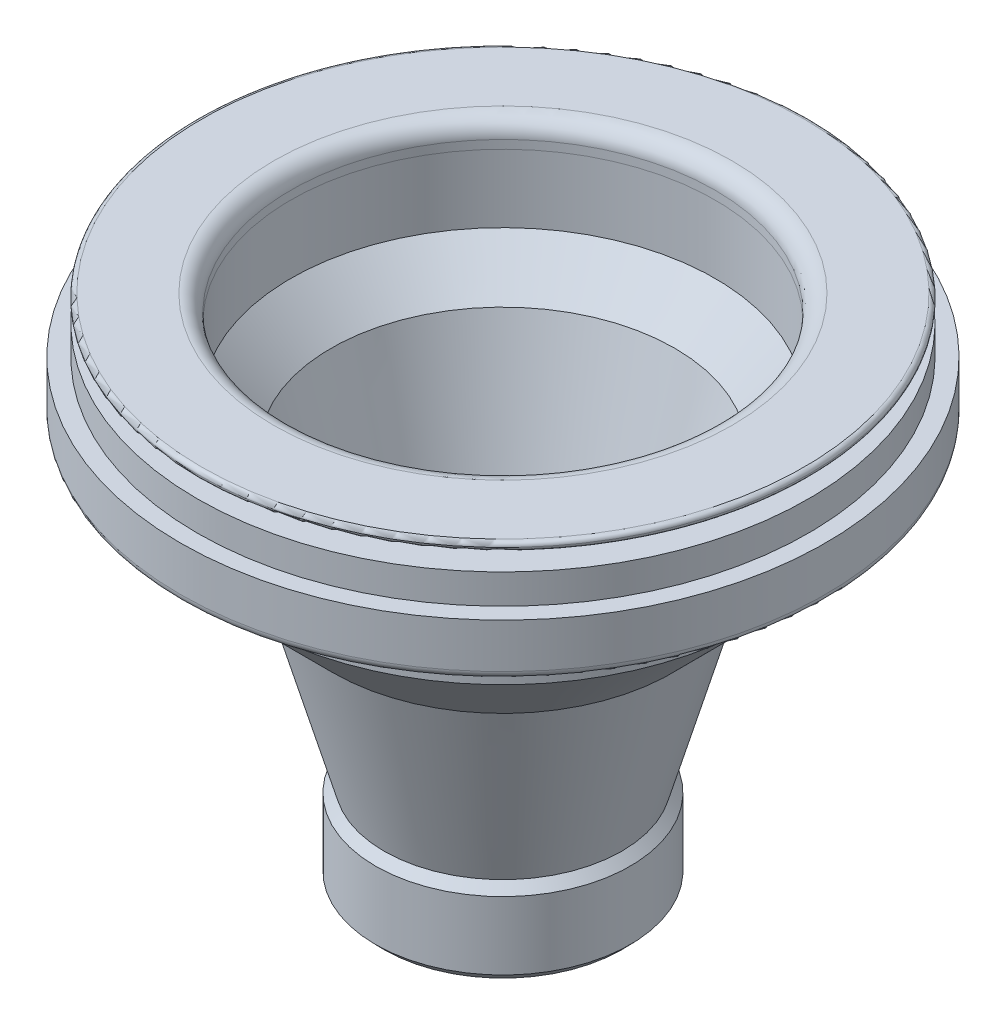
ISO-10303-21;
HEADER;
FILE_DESCRIPTION(('STEP AP214'),'2;1');
FILE_NAME('part.step','',(''),(''),'','','');
FILE_SCHEMA(('AUTOMOTIVE_DESIGN { 1 0 10303 214 1 1 1 1 }'));
ENDSEC;
DATA;
#1=APPLICATION_CONTEXT('core data for automotive mechanical design processes');
#2=APPLICATION_PROTOCOL_DEFINITION('international standard','automotive_design',2000,#1);
#3=PRODUCT_CONTEXT('',#1,'mechanical');
#4=PRODUCT('Part','Part','',(#3));
#5=PRODUCT_RELATED_PRODUCT_CATEGORY('part','',(#4));
#6=PRODUCT_DEFINITION_FORMATION('','',#4);
#7=PRODUCT_DEFINITION_CONTEXT('part definition',#1,'design');
#8=PRODUCT_DEFINITION('design','',#6,#7);
#9=PRODUCT_DEFINITION_SHAPE('','',#8);
#10=(LENGTH_UNIT() NAMED_UNIT(*) SI_UNIT(.MILLI.,.METRE.));
#11=(NAMED_UNIT(*) PLANE_ANGLE_UNIT() SI_UNIT($,.RADIAN.));
#12=(NAMED_UNIT(*) SI_UNIT($,.STERADIAN.) SOLID_ANGLE_UNIT());
#13=UNCERTAINTY_MEASURE_WITH_UNIT(LENGTH_MEASURE(1.E-05),#10,'distance_accuracy_value','');
#14=(GEOMETRIC_REPRESENTATION_CONTEXT(3) GLOBAL_UNCERTAINTY_ASSIGNED_CONTEXT((#13)) GLOBAL_UNIT_ASSIGNED_CONTEXT((#10,
#11,#12)) REPRESENTATION_CONTEXT('',''));
#15=CARTESIAN_POINT('',(0.,0.,0.));
#16=DIRECTION('',(0.,0.,1.));
#17=DIRECTION('',(1.,0.,0.));
#18=AXIS2_PLACEMENT_3D('',#15,#16,#17);
#19=CARTESIAN_POINT('',(685.8,-228.6,-317.5));
#20=DIRECTION('',(0.,1.,0.));
#21=DIRECTION('',(0.,0.,1.));
#22=AXIS2_PLACEMENT_3D('',#19,#20,#21);
#23=CYLINDRICAL_SURFACE('',#22,44.45);
#24=CARTESIAN_POINT('',(685.8,-231.775,-317.5));
#25=DIRECTION('',(0.,1.,0.));
#26=DIRECTION('',(0.,0.,1.));
#27=AXIS2_PLACEMENT_3D('',#24,#25,#26);
#28=CIRCLE('',#27,44.45);
#29=CARTESIAN_POINT('',(685.8,-231.775,-273.05));
#30=VERTEX_POINT('',#29);
#31=EDGE_CURVE('E70',#30,#30,#28,.T.);
#32=ORIENTED_EDGE('',*,*,#31,.T.);
#33=EDGE_LOOP('',(#32));
#34=FACE_BOUND('',#33,.T.);
#35=CARTESIAN_POINT('',(685.8,-228.6,-317.5));
#36=DIRECTION('',(0.,1.,0.));
#37=DIRECTION('',(0.,0.,1.));
#38=AXIS2_PLACEMENT_3D('',#35,#36,#37);
#39=CIRCLE('',#38,44.45);
#40=CARTESIAN_POINT('',(685.8,-228.6,-273.05));
#41=VERTEX_POINT('',#40);
#42=EDGE_CURVE('E64',#41,#41,#39,.T.);
#43=ORIENTED_EDGE('',*,*,#42,.F.);
#44=EDGE_LOOP('',(#43));
#45=FACE_BOUND('',#44,.T.);
#46=ADVANCED_FACE('F44',(#34,#45),#23,.T.);
#47=CARTESIAN_POINT('',(0.,-228.6,-317.5));
#48=DIRECTION('',(0.,1.,0.));
#49=DIRECTION('',(0.,0.,1.));
#50=AXIS2_PLACEMENT_3D('',#47,#48,#49);
#51=PLANE('',#50);
#52=CARTESIAN_POINT('',(685.8,-228.6,-317.5));
#53=DIRECTION('',(0.,1.,0.));
#54=DIRECTION('',(0.,0.,1.));
#55=AXIS2_PLACEMENT_3D('',#52,#53,#54);
#56=CIRCLE('',#55,56.35625);
#57=CARTESIAN_POINT('',(685.8,-228.6,-261.14375));
#58=VERTEX_POINT('',#57);
#59=EDGE_CURVE('E52',#58,#58,#56,.F.);
#60=ORIENTED_EDGE('',*,*,#59,.T.);
#61=EDGE_LOOP('',(#60));
#62=FACE_BOUND('',#61,.T.);
#63=ORIENTED_EDGE('',*,*,#42,.T.);
#64=EDGE_LOOP('',(#63));
#65=FACE_BOUND('',#64,.T.);
#66=ADVANCED_FACE('F91',(#62,#65),#51,.F.);
#67=CARTESIAN_POINT('',(3.60822483003177E-13,-227.0125,-317.5));
#68=DIRECTION('',(0.,-1.,0.));
#69=DIRECTION('',(0.,0.,-1.));
#70=AXIS2_PLACEMENT_3D('',#67,#68,#69);
#71=PLANE('',#70);
#72=CARTESIAN_POINT('',(685.8,-227.0125,-317.5));
#73=DIRECTION('',(0.,-1.,0.));
#74=DIRECTION('',(0.,0.,-1.));
#75=AXIS2_PLACEMENT_3D('',#72,#73,#74);
#76=CIRCLE('',#75,56.35625);
#77=CARTESIAN_POINT('',(685.8,-227.0125,-373.85625));
#78=VERTEX_POINT('',#77);
#79=EDGE_CURVE('E11',#78,#78,#76,.F.);
#80=ORIENTED_EDGE('',*,*,#79,.T.);
#81=EDGE_LOOP('',(#80));
#82=FACE_BOUND('',#81,.T.);
#83=CARTESIAN_POINT('',(685.8,-227.0125,-317.5));
#84=DIRECTION('',(0.,-1.,0.));
#85=DIRECTION('',(0.,0.,-1.));
#86=AXIS2_PLACEMENT_3D('',#83,#84,#85);
#87=CIRCLE('',#86,42.8625);
#88=CARTESIAN_POINT('',(685.8,-227.0125,-360.3625));
#89=VERTEX_POINT('',#88);
#90=EDGE_CURVE('E56',#89,#89,#87,.T.);
#91=ORIENTED_EDGE('',*,*,#90,.T.);
#92=EDGE_LOOP('',(#91));
#93=FACE_BOUND('',#92,.T.);
#94=ADVANCED_FACE('F96',(#82,#93),#71,.F.);
#95=CARTESIAN_POINT('',(685.8,-228.6,-317.5));
#96=DIRECTION('',(0.,1.,0.));
#97=DIRECTION('',(0.,0.,1.));
#98=AXIS2_PLACEMENT_3D('',#95,#96,#97);
#99=CYLINDRICAL_SURFACE('',#98,39.6875);
#100=CARTESIAN_POINT('',(685.8,-230.1875,-317.5));
#101=DIRECTION('',(0.,-1.,0.));
#102=DIRECTION('',(0.,0.,-1.));
#103=AXIS2_PLACEMENT_3D('',#100,#101,#102);
#104=CIRCLE('',#103,39.6875);
#105=CARTESIAN_POINT('',(685.8,-230.1875,-357.1875));
#106=VERTEX_POINT('',#105);
#107=EDGE_CURVE('E61',#106,#106,#104,.F.);
#108=ORIENTED_EDGE('',*,*,#107,.T.);
#109=EDGE_LOOP('',(#108));
#110=FACE_BOUND('',#109,.T.);
#111=CARTESIAN_POINT('',(685.8,-231.775,-317.5));
#112=DIRECTION('',(0.,1.,0.));
#113=DIRECTION('',(0.,0.,1.));
#114=AXIS2_PLACEMENT_3D('',#111,#112,#113);
#115=CIRCLE('',#114,39.6875);
#116=CARTESIAN_POINT('',(685.8,-231.775,-277.8125));
#117=VERTEX_POINT('',#116);
#118=EDGE_CURVE('E67',#117,#117,#115,.T.);
#119=ORIENTED_EDGE('',*,*,#118,.F.);
#120=EDGE_LOOP('',(#119));
#121=FACE_BOUND('',#120,.T.);
#122=ADVANCED_FACE('F103',(#110,#121),#99,.F.);
#123=CARTESIAN_POINT('',(0.,-231.775,-317.5));
#124=DIRECTION('',(0.,-1.,0.));
#125=DIRECTION('',(0.,0.,-1.));
#126=AXIS2_PLACEMENT_3D('',#123,#124,#125);
#127=PLANE('',#126);
#128=ORIENTED_EDGE('',*,*,#118,.T.);
#129=EDGE_LOOP('',(#128));
#130=FACE_BOUND('',#129,.T.);
#131=ORIENTED_EDGE('',*,*,#31,.F.);
#132=EDGE_LOOP('',(#131));
#133=FACE_BOUND('',#132,.T.);
#134=ADVANCED_FACE('F87',(#130,#133),#127,.T.);
#135=CARTESIAN_POINT('',(685.8,-230.1875,-317.5));
#136=DIRECTION('',(0.,-1.,0.));
#137=DIRECTION('',(0.,0.,-1.));
#138=AXIS2_PLACEMENT_3D('',#135,#136,#137);
#139=TOROIDAL_SURFACE('',#138,42.8625,3.175);
#140=ORIENTED_EDGE('',*,*,#90,.F.);
#141=EDGE_LOOP('',(#140));
#142=FACE_BOUND('',#141,.T.);
#143=ORIENTED_EDGE('',*,*,#107,.F.);
#144=EDGE_LOOP('',(#143));
#145=FACE_BOUND('',#144,.T.);
#146=ADVANCED_FACE('F80',(#142,#145),#139,.T.);
#147=CARTESIAN_POINT('',(685.8,-227.80625,-317.5));
#148=DIRECTION('',(0.,-1.,0.));
#149=DIRECTION('',(0.,0.,-1.));
#150=AXIS2_PLACEMENT_3D('',#147,#148,#149);
#151=TOROIDAL_SURFACE('',#150,56.35625,0.79375);
#152=ORIENTED_EDGE('',*,*,#79,.F.);
#153=EDGE_LOOP('',(#152));
#154=FACE_BOUND('',#153,.T.);
#155=CARTESIAN_POINT('',(685.8,-227.80625,-317.5));
#156=DIRECTION('',(0.,-1.,0.));
#157=DIRECTION('',(0.,0.,-1.));
#158=AXIS2_PLACEMENT_3D('',#155,#156,#157);
#159=CIRCLE('',#158,57.15);
#160=CARTESIAN_POINT('',(685.8,-227.80625,-374.65));
#161=VERTEX_POINT('',#160);
#162=EDGE_CURVE('E48',#161,#161,#159,.T.);
#163=ORIENTED_EDGE('',*,*,#162,.F.);
#164=EDGE_LOOP('',(#163));
#165=FACE_BOUND('',#164,.T.);
#166=ADVANCED_FACE('F46',(#154,#165),#151,.T.);
#167=CARTESIAN_POINT('',(685.8,-227.80625,-317.5));
#168=DIRECTION('',(0.,1.,0.));
#169=DIRECTION('',(0.,0.,1.));
#170=AXIS2_PLACEMENT_3D('',#167,#168,#169);
#171=TOROIDAL_SURFACE('',#170,56.35625,0.79375);
#172=ORIENTED_EDGE('',*,*,#59,.F.);
#173=EDGE_LOOP('',(#172));
#174=FACE_BOUND('',#173,.T.);
#175=ORIENTED_EDGE('',*,*,#162,.T.);
#176=EDGE_LOOP('',(#175));
#177=FACE_BOUND('',#176,.T.);
#178=ADVANCED_FACE('F77',(#174,#177),#171,.T.);
#179=CLOSED_SHELL('',(#46,#66,#94,#122,#134,#146,#166,#178));
#180=MANIFOLD_SOLID_BREP('B2',#179);
#181=CARTESIAN_POINT('',(685.8,-306.308125,-317.5));
#182=DIRECTION('',(0.,1.,0.));
#183=DIRECTION('',(0.,0.,1.));
#184=AXIS2_PLACEMENT_3D('',#181,#182,#183);
#185=CONICAL_SURFACE('',#184,22.2250000000001,0.275805898588525);
#186=CARTESIAN_POINT('',(685.8,-272.653125,-317.5));
#187=DIRECTION('',(0.,1.,0.));
#188=DIRECTION('',(0.,0.,1.));
#189=AXIS2_PLACEMENT_3D('',#186,#187,#188);
#190=CIRCLE('',#189,31.7500000000002);
#191=CARTESIAN_POINT('',(685.8,-272.653125,-285.75));
#192=VERTEX_POINT('',#191);
#193=EDGE_CURVE('E43',#192,#192,#190,.T.);
#194=ORIENTED_EDGE('',*,*,#193,.F.);
#195=EDGE_LOOP('',(#194));
#196=FACE_BOUND('',#195,.T.);
#197=CARTESIAN_POINT('',(685.8,-306.308125,-317.5));
#198=DIRECTION('',(0.,1.,0.));
#199=DIRECTION('',(0.,0.,1.));
#200=AXIS2_PLACEMENT_3D('',#197,#198,#199);
#201=CIRCLE('',#200,22.2250000000001);
#202=CARTESIAN_POINT('',(685.8,-306.308125,-295.275));
#203=VERTEX_POINT('',#202);
#204=EDGE_CURVE('E220',#203,#203,#201,.T.);
#205=ORIENTED_EDGE('',*,*,#204,.T.);
#206=EDGE_LOOP('',(#205));
#207=FACE_BOUND('',#206,.T.);
#208=ADVANCED_FACE('F165',(#196,#207),#185,.T.);
#209=CARTESIAN_POINT('',(685.8,-256.778125,-317.5));
#210=DIRECTION('',(0.,1.,0.));
#211=DIRECTION('',(0.,0.,1.));
#212=AXIS2_PLACEMENT_3D('',#209,#210,#211);
#213=CONICAL_SURFACE('',#212,47.625,0.785398163397445);
#214=ORIENTED_EDGE('',*,*,#193,.T.);
#215=EDGE_LOOP('',(#214));
#216=FACE_BOUND('',#215,.T.);
#217=CARTESIAN_POINT('',(685.8,-256.778125,-317.5));
#218=DIRECTION('',(0.,1.,0.));
#219=DIRECTION('',(0.,0.,1.));
#220=AXIS2_PLACEMENT_3D('',#217,#218,#219);
#221=CIRCLE('',#220,47.625);
#222=CARTESIAN_POINT('',(685.8,-256.778125,-269.875));
#223=VERTEX_POINT('',#222);
#224=EDGE_CURVE('E171',#223,#223,#221,.T.);
#225=ORIENTED_EDGE('',*,*,#224,.F.);
#226=EDGE_LOOP('',(#225));
#227=FACE_BOUND('',#226,.T.);
#228=ADVANCED_FACE('F237',(#216,#227),#213,.T.);
#229=CARTESIAN_POINT('',(685.8,-228.6,-317.5));
#230=DIRECTION('',(0.,1.,0.));
#231=DIRECTION('',(0.,0.,1.));
#232=AXIS2_PLACEMENT_3D('',#229,#230,#231);
#233=CYLINDRICAL_SURFACE('',#232,47.625);
#234=ORIENTED_EDGE('',*,*,#224,.T.);
#235=EDGE_LOOP('',(#234));
#236=FACE_BOUND('',#235,.T.);
#237=CARTESIAN_POINT('',(685.8,-247.253125,-317.5));
#238=DIRECTION('',(0.,1.,0.));
#239=DIRECTION('',(0.,0.,1.));
#240=AXIS2_PLACEMENT_3D('',#237,#238,#239);
#241=CIRCLE('',#240,47.625);
#242=CARTESIAN_POINT('',(685.8,-247.253125,-269.875));
#243=VERTEX_POINT('',#242);
#244=EDGE_CURVE('E175',#243,#243,#241,.T.);
#245=ORIENTED_EDGE('',*,*,#244,.F.);
#246=EDGE_LOOP('',(#245));
#247=FACE_BOUND('',#246,.T.);
#248=ADVANCED_FACE('F242',(#236,#247),#233,.T.);
#249=CARTESIAN_POINT('',(-1.16835970327951E-13,-247.253125,-317.5));
#250=DIRECTION('',(0.,1.,0.));
#251=DIRECTION('',(0.,0.,1.));
#252=AXIS2_PLACEMENT_3D('',#249,#250,#251);
#253=PLANE('',#252);
#254=CARTESIAN_POINT('',(685.8,-247.253125,-317.5));
#255=DIRECTION('',(0.,1.,0.));
#256=DIRECTION('',(0.,0.,1.));
#257=AXIS2_PLACEMENT_3D('',#254,#255,#256);
#258=CIRCLE('',#257,58.7375);
#259=CARTESIAN_POINT('',(685.8,-247.253125,-258.7625));
#260=VERTEX_POINT('',#259);
#261=EDGE_CURVE('E179',#260,#260,#258,.T.);
#262=ORIENTED_EDGE('',*,*,#261,.F.);
#263=EDGE_LOOP('',(#262));
#264=FACE_BOUND('',#263,.T.);
#265=ORIENTED_EDGE('',*,*,#244,.T.);
#266=EDGE_LOOP('',(#265));
#267=FACE_BOUND('',#266,.T.);
#268=ADVANCED_FACE('F246',(#264,#267),#253,.F.);
#269=CARTESIAN_POINT('',(685.8,-245.665625,-317.5));
#270=DIRECTION('',(0.,1.,0.));
#271=DIRECTION('',(0.,0.,1.));
#272=AXIS2_PLACEMENT_3D('',#269,#270,#271);
#273=TOROIDAL_SURFACE('',#272,58.7375,1.58749999999999);
#274=CARTESIAN_POINT('',(685.8,-245.665625,-317.5));
#275=DIRECTION('',(0.,1.,0.));
#276=DIRECTION('',(0.,0.,1.));
#277=AXIS2_PLACEMENT_3D('',#274,#275,#276);
#278=CIRCLE('',#277,60.325);
#279=CARTESIAN_POINT('',(685.8,-245.665625,-257.175));
#280=VERTEX_POINT('',#279);
#281=EDGE_CURVE('E184',#280,#280,#278,.T.);
#282=ORIENTED_EDGE('',*,*,#281,.F.);
#283=EDGE_LOOP('',(#282));
#284=FACE_BOUND('',#283,.T.);
#285=ORIENTED_EDGE('',*,*,#261,.T.);
#286=EDGE_LOOP('',(#285));
#287=FACE_BOUND('',#286,.T.);
#288=ADVANCED_FACE('F252',(#284,#287),#273,.T.);
#289=CARTESIAN_POINT('',(685.8,-228.6,-317.5));
#290=DIRECTION('',(0.,1.,0.));
#291=DIRECTION('',(0.,0.,1.));
#292=AXIS2_PLACEMENT_3D('',#289,#290,#291);
#293=CYLINDRICAL_SURFACE('',#292,60.325);
#294=CARTESIAN_POINT('',(685.8,-237.33125,-317.5));
#295=DIRECTION('',(0.,1.,0.));
#296=DIRECTION('',(0.,0.,1.));
#297=AXIS2_PLACEMENT_3D('',#294,#295,#296);
#298=CIRCLE('',#297,60.325);
#299=CARTESIAN_POINT('',(685.8,-237.33125,-257.175));
#300=VERTEX_POINT('',#299);
#301=EDGE_CURVE('E187',#300,#300,#298,.T.);
#302=ORIENTED_EDGE('',*,*,#301,.F.);
#303=EDGE_LOOP('',(#302));
#304=FACE_BOUND('',#303,.T.);
#305=ORIENTED_EDGE('',*,*,#281,.T.);
#306=EDGE_LOOP('',(#305));
#307=FACE_BOUND('',#306,.T.);
#308=ADVANCED_FACE('F256',(#304,#307),#293,.T.);
#309=CARTESIAN_POINT('',(0.,-237.33125,-317.5));
#310=DIRECTION('',(0.,1.,0.));
#311=DIRECTION('',(0.,0.,1.));
#312=AXIS2_PLACEMENT_3D('',#309,#310,#311);
#313=PLANE('',#312);
#314=ORIENTED_EDGE('',*,*,#301,.T.);
#315=EDGE_LOOP('',(#314));
#316=FACE_BOUND('',#315,.T.);
#317=CARTESIAN_POINT('',(685.8,-237.33125,-317.5));
#318=DIRECTION('',(0.,1.,0.));
#319=DIRECTION('',(0.,0.,1.));
#320=AXIS2_PLACEMENT_3D('',#317,#318,#319);
#321=CIRCLE('',#320,57.15);
#322=CARTESIAN_POINT('',(685.8,-237.33125,-260.35));
#323=VERTEX_POINT('',#322);
#324=EDGE_CURVE('E190',#323,#323,#321,.T.);
#325=ORIENTED_EDGE('',*,*,#324,.F.);
#326=EDGE_LOOP('',(#325));
#327=FACE_BOUND('',#326,.T.);
#328=ADVANCED_FACE('F260',(#316,#327),#313,.T.);
#329=CARTESIAN_POINT('',(685.8,-228.6,-317.5));
#330=DIRECTION('',(0.,1.,0.));
#331=DIRECTION('',(0.,0.,1.));
#332=AXIS2_PLACEMENT_3D('',#329,#330,#331);
#333=CYLINDRICAL_SURFACE('',#332,57.15);
#334=ORIENTED_EDGE('',*,*,#324,.T.);
#335=EDGE_LOOP('',(#334));
#336=FACE_BOUND('',#335,.T.);
#337=CARTESIAN_POINT('',(685.8,-231.775,-317.5));
#338=DIRECTION('',(0.,1.,0.));
#339=DIRECTION('',(0.,0.,1.));
#340=AXIS2_PLACEMENT_3D('',#337,#338,#339);
#341=CIRCLE('',#340,57.15);
#342=CARTESIAN_POINT('',(685.8,-231.775,-260.35));
#343=VERTEX_POINT('',#342);
#344=EDGE_CURVE('E193',#343,#343,#341,.T.);
#345=ORIENTED_EDGE('',*,*,#344,.F.);
#346=EDGE_LOOP('',(#345));
#347=FACE_BOUND('',#346,.T.);
#348=ADVANCED_FACE('F264',(#336,#347),#333,.T.);
#349=CARTESIAN_POINT('',(0.,-231.775,-317.5));
#350=DIRECTION('',(0.,-1.,0.));
#351=DIRECTION('',(0.,0.,-1.));
#352=AXIS2_PLACEMENT_3D('',#349,#350,#351);
#353=PLANE('',#352);
#354=CARTESIAN_POINT('',(685.8,-231.775,-317.5));
#355=DIRECTION('',(0.,1.,0.));
#356=DIRECTION('',(0.,0.,1.));
#357=AXIS2_PLACEMENT_3D('',#354,#355,#356);
#358=CIRCLE('',#357,39.6875);
#359=CARTESIAN_POINT('',(685.8,-231.775,-277.8125));
#360=VERTEX_POINT('',#359);
#361=EDGE_CURVE('E196',#360,#360,#358,.T.);
#362=ORIENTED_EDGE('',*,*,#361,.F.);
#363=EDGE_LOOP('',(#362));
#364=FACE_BOUND('',#363,.T.);
#365=ORIENTED_EDGE('',*,*,#344,.T.);
#366=EDGE_LOOP('',(#365));
#367=FACE_BOUND('',#366,.T.);
#368=ADVANCED_FACE('F268',(#364,#367),#353,.F.);
#369=CARTESIAN_POINT('',(685.8,-228.6,-317.5));
#370=DIRECTION('',(0.,1.,0.));
#371=DIRECTION('',(0.,0.,1.));
#372=AXIS2_PLACEMENT_3D('',#369,#370,#371);
#373=CYLINDRICAL_SURFACE('',#372,39.6875);
#374=CARTESIAN_POINT('',(685.8,-244.475,-317.5));
#375=DIRECTION('',(0.,1.,0.));
#376=DIRECTION('',(0.,0.,1.));
#377=AXIS2_PLACEMENT_3D('',#374,#375,#376);
#378=CIRCLE('',#377,39.6875);
#379=CARTESIAN_POINT('',(685.8,-244.475,-277.8125));
#380=VERTEX_POINT('',#379);
#381=EDGE_CURVE('E199',#380,#380,#378,.T.);
#382=ORIENTED_EDGE('',*,*,#381,.F.);
#383=EDGE_LOOP('',(#382));
#384=FACE_BOUND('',#383,.T.);
#385=ORIENTED_EDGE('',*,*,#361,.T.);
#386=EDGE_LOOP('',(#385));
#387=FACE_BOUND('',#386,.T.);
#388=ADVANCED_FACE('F272',(#384,#387),#373,.F.);
#389=CARTESIAN_POINT('',(685.8,-244.475,-317.5));
#390=DIRECTION('',(0.,1.,0.));
#391=DIRECTION('',(0.,0.,1.));
#392=AXIS2_PLACEMENT_3D('',#389,#390,#391);
#393=CONICAL_SURFACE('',#392,39.6875,0.785398163397456);
#394=CARTESIAN_POINT('',(685.8,-252.015625,-317.5));
#395=DIRECTION('',(0.,1.,0.));
#396=DIRECTION('',(0.,0.,1.));
#397=AXIS2_PLACEMENT_3D('',#394,#395,#396);
#398=CIRCLE('',#397,32.1468749999999);
#399=CARTESIAN_POINT('',(685.8,-252.015625,-285.353125));
#400=VERTEX_POINT('',#399);
#401=EDGE_CURVE('E202',#400,#400,#398,.T.);
#402=ORIENTED_EDGE('',*,*,#401,.F.);
#403=EDGE_LOOP('',(#402));
#404=FACE_BOUND('',#403,.T.);
#405=ORIENTED_EDGE('',*,*,#381,.T.);
#406=EDGE_LOOP('',(#405));
#407=FACE_BOUND('',#406,.T.);
#408=ADVANCED_FACE('F276',(#404,#407),#393,.F.);
#409=CARTESIAN_POINT('',(685.8,-252.015625,-317.5));
#410=DIRECTION('',(0.,1.,0.));
#411=DIRECTION('',(0.,0.,1.));
#412=AXIS2_PLACEMENT_3D('',#409,#410,#411);
#413=CONICAL_SURFACE('',#412,32.1468749999999,0.275805898588519);
#414=CARTESIAN_POINT('',(685.8,-298.29125,-317.5));
#415=DIRECTION('',(0.,1.,0.));
#416=DIRECTION('',(0.,0.,1.));
#417=AXIS2_PLACEMENT_3D('',#414,#415,#416);
#418=CIRCLE('',#417,19.05);
#419=CARTESIAN_POINT('',(685.8,-298.29125,-298.45));
#420=VERTEX_POINT('',#419);
#421=EDGE_CURVE('E205',#420,#420,#418,.T.);
#422=ORIENTED_EDGE('',*,*,#421,.F.);
#423=EDGE_LOOP('',(#422));
#424=FACE_BOUND('',#423,.T.);
#425=ORIENTED_EDGE('',*,*,#401,.T.);
#426=EDGE_LOOP('',(#425));
#427=FACE_BOUND('',#426,.T.);
#428=ADVANCED_FACE('F280',(#424,#427),#413,.F.);
#429=CARTESIAN_POINT('',(685.8,-228.6,-317.5));
#430=DIRECTION('',(0.,1.,0.));
#431=DIRECTION('',(0.,0.,1.));
#432=AXIS2_PLACEMENT_3D('',#429,#430,#431);
#433=CYLINDRICAL_SURFACE('',#432,19.05);
#434=CARTESIAN_POINT('',(685.8,-322.2625,-317.5));
#435=DIRECTION('',(0.,1.,0.));
#436=DIRECTION('',(0.,0.,1.));
#437=AXIS2_PLACEMENT_3D('',#434,#435,#436);
#438=CIRCLE('',#437,19.05);
#439=CARTESIAN_POINT('',(685.8,-322.2625,-298.45));
#440=VERTEX_POINT('',#439);
#441=EDGE_CURVE('E208',#440,#440,#438,.T.);
#442=ORIENTED_EDGE('',*,*,#441,.F.);
#443=EDGE_LOOP('',(#442));
#444=FACE_BOUND('',#443,.T.);
#445=ORIENTED_EDGE('',*,*,#421,.T.);
#446=EDGE_LOOP('',(#445));
#447=FACE_BOUND('',#446,.T.);
#448=ADVANCED_FACE('F284',(#444,#447),#433,.F.);
#449=CARTESIAN_POINT('',(0.,-322.2625,-317.5));
#450=DIRECTION('',(0.,1.,0.));
#451=DIRECTION('',(0.,0.,1.));
#452=AXIS2_PLACEMENT_3D('',#449,#450,#451);
#453=PLANE('',#452);
#454=CARTESIAN_POINT('',(685.8,-322.2625,-317.5));
#455=DIRECTION('',(0.,1.,0.));
#456=DIRECTION('',(0.,0.,1.));
#457=AXIS2_PLACEMENT_3D('',#454,#455,#456);
#458=CIRCLE('',#457,22.2250000000001);
#459=CARTESIAN_POINT('',(685.8,-322.2625,-295.275));
#460=VERTEX_POINT('',#459);
#461=EDGE_CURVE('E211',#460,#460,#458,.T.);
#462=ORIENTED_EDGE('',*,*,#461,.F.);
#463=EDGE_LOOP('',(#462));
#464=FACE_BOUND('',#463,.T.);
#465=ORIENTED_EDGE('',*,*,#441,.T.);
#466=EDGE_LOOP('',(#465));
#467=FACE_BOUND('',#466,.T.);
#468=ADVANCED_FACE('F288',(#464,#467),#453,.F.);
#469=CARTESIAN_POINT('',(685.8,-320.6353125,-317.5));
#470=DIRECTION('',(0.,1.,0.));
#471=DIRECTION('',(0.,0.,1.));
#472=AXIS2_PLACEMENT_3D('',#469,#470,#471);
#473=CONICAL_SURFACE('',#472,23.8125,0.773053111553225);
#474=ORIENTED_EDGE('',*,*,#461,.T.);
#475=EDGE_LOOP('',(#474));
#476=FACE_BOUND('',#475,.T.);
#477=CARTESIAN_POINT('',(685.8,-320.6353125,-317.5));
#478=DIRECTION('',(0.,1.,0.));
#479=DIRECTION('',(0.,0.,1.));
#480=AXIS2_PLACEMENT_3D('',#477,#478,#479);
#481=CIRCLE('',#480,23.8125);
#482=CARTESIAN_POINT('',(685.8,-320.6353125,-293.6875));
#483=VERTEX_POINT('',#482);
#484=EDGE_CURVE('E214',#483,#483,#481,.T.);
#485=ORIENTED_EDGE('',*,*,#484,.F.);
#486=EDGE_LOOP('',(#485));
#487=FACE_BOUND('',#486,.T.);
#488=ADVANCED_FACE('F233',(#476,#487),#473,.T.);
#489=CARTESIAN_POINT('',(685.8,-228.6,-317.5));
#490=DIRECTION('',(0.,1.,0.));
#491=DIRECTION('',(0.,0.,1.));
#492=AXIS2_PLACEMENT_3D('',#489,#490,#491);
#493=CYLINDRICAL_SURFACE('',#492,23.8125);
#494=ORIENTED_EDGE('',*,*,#484,.T.);
#495=EDGE_LOOP('',(#494));
#496=FACE_BOUND('',#495,.T.);
#497=CARTESIAN_POINT('',(685.8,-307.9353125,-317.5));
#498=DIRECTION('',(0.,1.,0.));
#499=DIRECTION('',(0.,0.,1.));
#500=AXIS2_PLACEMENT_3D('',#497,#498,#499);
#501=CIRCLE('',#500,23.8125);
#502=CARTESIAN_POINT('',(685.8,-307.9353125,-293.6875));
#503=VERTEX_POINT('',#502);
#504=EDGE_CURVE('E217',#503,#503,#501,.T.);
#505=ORIENTED_EDGE('',*,*,#504,.F.);
#506=EDGE_LOOP('',(#505));
#507=FACE_BOUND('',#506,.T.);
#508=ADVANCED_FACE('F227',(#496,#507),#493,.T.);
#509=CARTESIAN_POINT('',(685.8,-306.308125,-317.5));
#510=DIRECTION('',(0.,-1.,0.));
#511=DIRECTION('',(0.,0.,-1.));
#512=AXIS2_PLACEMENT_3D('',#509,#510,#511);
#513=CONICAL_SURFACE('',#512,22.2250000000001,0.773053111553259);
#514=ORIENTED_EDGE('',*,*,#504,.T.);
#515=EDGE_LOOP('',(#514));
#516=FACE_BOUND('',#515,.T.);
#517=ORIENTED_EDGE('',*,*,#204,.F.);
#518=EDGE_LOOP('',(#517));
#519=FACE_BOUND('',#518,.T.);
#520=ADVANCED_FACE('F225',(#516,#519),#513,.T.);
#521=CLOSED_SHELL('',(#208,#228,#248,#268,#288,#308,#328,#348,#368,#388,#408,#428,#448,#468,
#488,#508,#520));
#522=MANIFOLD_SOLID_BREP('B6',#521);
#523=ADVANCED_BREP_SHAPE_REPRESENTATION('',(#18,#180,#522),#14);
#524=SHAPE_DEFINITION_REPRESENTATION(#9,#523);
ENDSEC;
END-ISO-10303-21;
